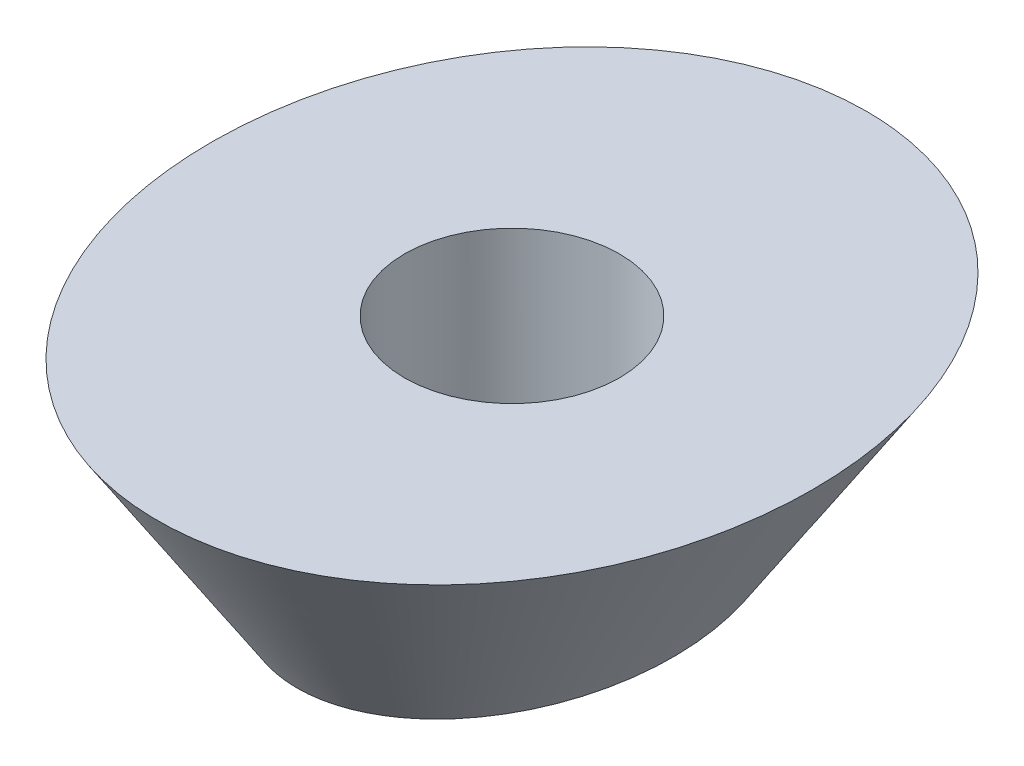
ISO-10303-21;
HEADER;
FILE_DESCRIPTION(('STEP AP214'),'2;1');
FILE_NAME('part.step','',(''),(''),'','','');
FILE_SCHEMA(('AUTOMOTIVE_DESIGN { 1 0 10303 214 1 1 1 1 }'));
ENDSEC;
DATA;
#1=APPLICATION_CONTEXT('core data for automotive mechanical design processes');
#2=APPLICATION_PROTOCOL_DEFINITION('international standard','automotive_design',2000,#1);
#3=PRODUCT_CONTEXT('',#1,'mechanical');
#4=PRODUCT('Part','Part','',(#3));
#5=PRODUCT_RELATED_PRODUCT_CATEGORY('part','',(#4));
#6=PRODUCT_DEFINITION_FORMATION('','',#4);
#7=PRODUCT_DEFINITION_CONTEXT('part definition',#1,'design');
#8=PRODUCT_DEFINITION('design','',#6,#7);
#9=PRODUCT_DEFINITION_SHAPE('','',#8);
#10=(LENGTH_UNIT() NAMED_UNIT(*) SI_UNIT(.MILLI.,.METRE.));
#11=(NAMED_UNIT(*) PLANE_ANGLE_UNIT() SI_UNIT($,.RADIAN.));
#12=(NAMED_UNIT(*) SI_UNIT($,.STERADIAN.) SOLID_ANGLE_UNIT());
#13=UNCERTAINTY_MEASURE_WITH_UNIT(LENGTH_MEASURE(1.E-05),#10,'distance_accuracy_value','');
#14=(GEOMETRIC_REPRESENTATION_CONTEXT(3) GLOBAL_UNCERTAINTY_ASSIGNED_CONTEXT((#13)) GLOBAL_UNIT_ASSIGNED_CONTEXT((#10,
#11,#12)) REPRESENTATION_CONTEXT('',''));
#15=CARTESIAN_POINT('',(0.,0.,0.));
#16=DIRECTION('',(0.,0.,1.));
#17=DIRECTION('',(1.,0.,0.));
#18=AXIS2_PLACEMENT_3D('',#15,#16,#17);
#19=CARTESIAN_POINT('',(0.,4.8,-7.11715644734806));
#20=CARTESIAN_POINT('',(-0.468372798234625,4.8,-7.11715644731902));
#21=CARTESIAN_POINT('',(-0.936415652271608,4.8,-7.05493538363841));
#22=CARTESIAN_POINT('',(-1.83231581849958,4.8,-6.81732789734766));
#23=CARTESIAN_POINT('',(-2.25987549087552,4.8,-6.64243262365492));
#24=CARTESIAN_POINT('',(-3.05022561451444,4.8,-6.20593431978818));
#25=CARTESIAN_POINT('',(-3.41320897304809,4.8,-5.94470711533813));
#26=CARTESIAN_POINT('',(-4.06730402702556,4.8,-5.36197067542401));
#27=CARTESIAN_POINT('',(-4.3586913790227,4.8,-5.0405264826891));
#28=CARTESIAN_POINT('',(-5.12775374626888,4.8,-4.01511001408688));
#29=CARTESIAN_POINT('',(-5.50117252272794,4.8,-3.25150960957499));
#30=CARTESIAN_POINT('',(-5.99574162187798,4.8,-1.65951572680395));
#31=CARTESIAN_POINT('',(-6.11715644734806,4.8,-0.829624889736534));
#32=CARTESIAN_POINT('',(-6.11715644734806,4.8,0.829624889736534));
#33=CARTESIAN_POINT('',(-5.99574162187776,4.8,1.65951572680418));
#34=CARTESIAN_POINT('',(-5.50117252272816,4.8,3.25150960957477));
#35=CARTESIAN_POINT('',(-5.12775374626867,4.8,4.01511001408682));
#36=CARTESIAN_POINT('',(-4.35869137902279,4.8,5.04052648268914));
#37=CARTESIAN_POINT('',(-4.06730402702548,4.8,5.36197067542402));
#38=CARTESIAN_POINT('',(-3.41320897304817,4.8,5.94470711533812));
#39=CARTESIAN_POINT('',(-3.0502256145144,4.8,6.20593431978825));
#40=CARTESIAN_POINT('',(-2.25987549087557,4.8,6.64243262365484));
#41=CARTESIAN_POINT('',(-1.83231581849958,4.79999999999991,6.81732789734738));
#42=CARTESIAN_POINT('',(-0.936415652271623,4.80000000000009,7.0549353836387));
#43=CARTESIAN_POINT('',(-0.46837273695167,4.8,7.11715644734806));
#44=CARTESIAN_POINT('',(0.468372736951669,4.8,7.11715644734806));
#45=CARTESIAN_POINT('',(0.936415652271613,4.8,7.05493538363853));
#46=CARTESIAN_POINT('',(1.83231581849957,4.8,6.81732789734755));
#47=CARTESIAN_POINT('',(2.25987549087547,4.8,6.64243262365493));
#48=CARTESIAN_POINT('',(3.05022561451447,4.8,6.20593431978817));
#49=CARTESIAN_POINT('',(3.41320897304811,4.8,5.94470711533812));
#50=CARTESIAN_POINT('',(4.06730402702552,4.8,5.36197067542403));
#51=CARTESIAN_POINT('',(4.3586913790229,4.8,5.04052648268923));
#52=CARTESIAN_POINT('',(5.12775374626848,4.8,4.01511001408661));
#53=CARTESIAN_POINT('',(5.50117252272772,4.8,3.25150960957492));
#54=CARTESIAN_POINT('',(5.99574162187819,4.8,1.65951572680405));
#55=CARTESIAN_POINT('',(6.11715644734806,4.8,0.829624889736524));
#56=CARTESIAN_POINT('',(6.11715644734806,4.8,-0.829624889736545));
#57=CARTESIAN_POINT('',(5.99574162187798,4.8,-1.65951572680414));
#58=CARTESIAN_POINT('',(5.50117252272795,4.8,-3.25150960957479));
#59=CARTESIAN_POINT('',(5.12775374626869,4.8,-4.01511001408653));
#60=CARTESIAN_POINT('',(4.35869137902281,4.8,-5.04052648268925));
#61=CARTESIAN_POINT('',(4.06730402702544,4.8,-5.36197067542393));
#62=CARTESIAN_POINT('',(3.41320897304822,4.8,-5.94470711533821));
#63=CARTESIAN_POINT('',(3.05022561451441,4.8,-6.20593431978821));
#64=CARTESIAN_POINT('',(2.25987549087556,4.8,-6.64243262365487));
#65=CARTESIAN_POINT('',(1.83231581849958,4.8,-6.81732789734756));
#66=CARTESIAN_POINT('',(0.936415652271627,4.8,-7.05493538363851));
#67=CARTESIAN_POINT('',(0.468372798234625,4.8,-7.1171564473771));
#68=CARTESIAN_POINT('',(0.,4.8,-7.11715644734806));
#69=CARTESIAN_POINT('',(0.,0.,-4.));
#70=CARTESIAN_POINT('',(-0.196349548121567,0.,-3.9999999999977));
#71=CARTESIAN_POINT('',(-0.392694230033098,0.,-3.97421564756369));
#72=CARTESIAN_POINT('',(-0.777847702063671,0.,-3.87206659566215));
#73=CARTESIAN_POINT('',(-0.966646978102348,0.,-3.79570441669364));
#74=CARTESIAN_POINT('',(-1.32945361608819,0.,-3.59533184339666));
#75=CARTESIAN_POINT('',(-1.50345202489101,0.,-3.47132639392211));
#76=CARTESIAN_POINT('',(-1.82996937322661,0.,-3.18043050449826));
#77=CARTESIAN_POINT('',(-1.98248025359338,0.,-3.01354724470113));
#78=CARTESIAN_POINT('',(-2.39900052349218,0.,-2.45818688483631));
#79=CARTESIAN_POINT('',(-2.62135916673537,0.,-2.01447591609965));
#80=CARTESIAN_POINT('',(-2.92191802833235,0.,-1.04699154282106));
#81=CARTESIAN_POINT('',(-3.,0.,-0.523598770144145));
#82=CARTESIAN_POINT('',(-3.,0.,0.523598770144145));
#83=CARTESIAN_POINT('',(-2.92191802833235,0.,1.04699154282112));
#84=CARTESIAN_POINT('',(-2.62135916673537,0.,2.0144759160996));
#85=CARTESIAN_POINT('',(-2.39900052349216,0.,2.4581868848362));
#86=CARTESIAN_POINT('',(-1.98248025359338,0.,3.01354724470119));
#87=CARTESIAN_POINT('',(-1.8299693732266,0.,3.18043050449826));
#88=CARTESIAN_POINT('',(-1.50345202489102,0.,3.4713263939221));
#89=CARTESIAN_POINT('',(-1.32945361608818,0.,3.59533184339669));
#90=CARTESIAN_POINT('',(-0.966646978102371,0.,3.7957044166936));
#91=CARTESIAN_POINT('',(-0.777847702063673,0.,3.87206659566209));
#92=CARTESIAN_POINT('',(-0.392694230033101,0.,3.97421564756375));
#93=CARTESIAN_POINT('',(-0.19634953721326,0.,4.));
#94=CARTESIAN_POINT('',(0.196349537213259,0.,4.));
#95=CARTESIAN_POINT('',(0.392694230033096,0.,3.97421564756366));
#96=CARTESIAN_POINT('',(0.777847702063668,0.,3.87206659566218));
#97=CARTESIAN_POINT('',(0.96664697810234,0.,3.7957044166936));
#98=CARTESIAN_POINT('',(1.32945361608819,0.,3.59533184339669));
#99=CARTESIAN_POINT('',(1.50345202489104,0.,3.4713263939221));
#100=CARTESIAN_POINT('',(1.82996937322657,0.,3.18043050449826));
#101=CARTESIAN_POINT('',(1.98248025359344,0.,3.01354724470118));
#102=CARTESIAN_POINT('',(2.39900052349206,0.,2.4581868848362));
#103=CARTESIAN_POINT('',(2.62135916673535,0.,2.01447591609975));
#104=CARTESIAN_POINT('',(2.92191802833237,0.,1.04699154282098));
#105=CARTESIAN_POINT('',(3.,0.,0.523598770144139));
#106=CARTESIAN_POINT('',(3.,0.,-0.523598770144152));
#107=CARTESIAN_POINT('',(2.92191802833237,0.,-1.04699154282108));
#108=CARTESIAN_POINT('',(2.62135916673536,0.,-2.01447591609963));
#109=CARTESIAN_POINT('',(2.3990005234922,0.,-2.45818688483621));
#110=CARTESIAN_POINT('',(1.98248025359337,0.,-3.01354724470117));
#111=CARTESIAN_POINT('',(1.82996937322657,0.,-3.18043050449826));
#112=CARTESIAN_POINT('',(1.50345202489105,0.,-3.4713263939221));
#113=CARTESIAN_POINT('',(1.32945361608818,0.,-3.59533184339668));
#114=CARTESIAN_POINT('',(0.966646978102363,0.,-3.79570441669361));
#115=CARTESIAN_POINT('',(0.777847702063665,0.,-3.87206659566211));
#116=CARTESIAN_POINT('',(0.392694230033112,0.,-3.97421564756373));
#117=CARTESIAN_POINT('',(0.196349548121567,0.,-4.0000000000023));
#118=CARTESIAN_POINT('',(0.,0.,-4.));
#119=B_SPLINE_SURFACE_WITH_KNOTS('',1,3,((#19,#20,#21,#22,#23,#24,#25,#26,#27,#28,#29,#30,#31,
#32,#33,#34,#35,#36,#37,#38,#39,#40,#41,#42,#43,#44,#45,#46,#47,#48,#49,#50,#51,#52,#53,#54,#55,
#56,#57,#58,#59,#60,#61,#62,#63,#64,#65,#66,#67,#68),(#69,#70,#71,#72,#73,#74,#75,#76,#77,#78,
#79,#80,#81,#82,#83,#84,#85,#86,#87,#88,#89,#90,#91,#92,#93,#94,#95,#96,#97,#98,#99,#100,#101,
#102,#103,#104,#105,#106,#107,#108,#109,#110,#111,#112,#113,#114,#115,#116,#117,#118)),
.UNSPECIFIED.,.F.,.T.,.F.,(2,2),(4,2,2,2,2,2,2,2,2,2,2,2,2,2,2,2,2,2,2,2,2,2,2,2,4),(0.,1.),(0.,
0.196349540849362,0.392699081698724,0.589048622548086,0.785398163397448,1.17809724509617,
1.5707963267949,1.96349540849362,2.35619449019234,2.55254403104171,2.74889357189107,
2.94524311274043,3.14159265358979,3.33794219443916,3.53429173528852,3.73064127613788,
3.92699081698724,4.31968989868597,4.71238898038469,5.10508806208341,5.49778714378214,
5.6941366846315,5.89048622548086,6.08683576633022,6.28318530717959),.UNSPECIFIED.);
#120=CARTESIAN_POINT('',(0.,4.,6.59763037279005));
#121=CARTESIAN_POINT('',(0.138631116862981,4.,6.59763053452745));
#122=CARTESIAN_POINT('',(0.27726054973254,4.,6.59160269040934));
#123=CARTESIAN_POINT('',(0.553498096117709,4.,6.56778523984111));
#124=CARTESIAN_POINT('',(0.691106210932047,4.,6.54999564835007));
#125=CARTESIAN_POINT('',(0.964337212031002,4.,6.50286110257067));
#126=CARTESIAN_POINT('',(1.09996002694897,4.,6.47351573393337));
#127=CARTESIAN_POINT('',(1.36821756636442,4.,6.40341857178731));
#128=CARTESIAN_POINT('',(1.50085230529413,4.,6.3626668333834));
#129=CARTESIAN_POINT('',(1.76200794267576,4.,6.27047626526121));
#130=CARTESIAN_POINT('',(1.89053767619937,4.,6.21906246403149));
#131=CARTESIAN_POINT('',(2.14299479957962,4.,6.10605801842716));
#132=CARTESIAN_POINT('',(2.26692222090733,4.,6.0444674436581));
#133=CARTESIAN_POINT('',(2.63077406220604,4.,5.84515279868461));
#134=CARTESIAN_POINT('',(2.86293724155269,4.,5.69282547132878));
#135=CARTESIAN_POINT('',(3.19874416787004,4.,5.43464953419965));
#136=CARTESIAN_POINT('',(3.31166027436498,4.,5.340439738385));
#137=CARTESIAN_POINT('',(3.52993096798742,4.,5.14357043976476));
#138=CARTESIAN_POINT('',(3.6352853850305,4.,5.0409107470078));
#139=CARTESIAN_POINT('',(3.83807757988468,4.,4.82802706053321));
#140=CARTESIAN_POINT('',(3.93551327541895,4.,4.71780109118153));
#141=CARTESIAN_POINT('',(4.12222444186623,4.,4.4906362118355));
#142=CARTESIAN_POINT('',(4.21149904138122,4.,4.37369658715829));
#143=CARTESIAN_POINT('',(4.39258737007877,4.,4.11872291231806));
#144=CARTESIAN_POINT('',(4.48328551624406,4.,3.97989519591661));
#145=CARTESIAN_POINT('',(4.65397917225272,4.,3.69584471924403));
#146=CARTESIAN_POINT('',(4.73397418044073,4.,3.5506216596473));
#147=CARTESIAN_POINT('',(4.957867252426,4.,3.10675874242896));
#148=CARTESIAN_POINT('',(5.08570530663447,4.,2.79987959602241));
#149=CARTESIAN_POINT('',(5.31569966537978,4.,2.12273310263659));
#150=CARTESIAN_POINT('',(5.41070132352746,4.,1.75006385737153));
#151=CARTESIAN_POINT('',(5.54453404105805,4.,0.994512394405259));
#152=CARTESIAN_POINT('',(5.58333111112678,4.,0.61162413923474));
#153=CARTESIAN_POINT('',(5.60057814606717,4.,0.011883551846272));
#154=CARTESIAN_POINT('',(5.59795872826184,4.,-0.204610037299844));
#155=CARTESIAN_POINT('',(5.57502772314921,4.,-0.636746048245827));
#156=CARTESIAN_POINT('',(5.55471309183651,4.,-0.852388317186284));
#157=CARTESIAN_POINT('',(5.49620939444608,4.,-1.28144074678698));
#158=CARTESIAN_POINT('',(5.45800342867334,4.,-1.49484860160921));
#159=CARTESIAN_POINT('',(5.36362877553437,4.,-1.9175701512093));
#160=CARTESIAN_POINT('',(5.3074679204221,4.,-2.1268855890059));
#161=CARTESIAN_POINT('',(5.17614849549433,4.,-2.5430011345345));
#162=CARTESIAN_POINT('',(5.10071378147414,4.,-2.74971446695683));
#163=CARTESIAN_POINT('',(4.93105706493666,4.,-3.15525033161455));
#164=CARTESIAN_POINT('',(4.83684005903408,4.,-3.35407494563846));
#165=CARTESIAN_POINT('',(4.62972071089114,4.,-3.7412126795497));
#166=CARTESIAN_POINT('',(4.51686101798824,4.,-3.92954850934014));
#167=CARTESIAN_POINT('',(4.27250270186423,4.,-4.29399829151783));
#168=CARTESIAN_POINT('',(4.14098441695062,4.,-4.47009905567432));
#169=CARTESIAN_POINT('',(3.7989125490882,4.,-4.88009664853678));
#170=CARTESIAN_POINT('',(3.57875140447251,4.,-5.10612070918666));
#171=CARTESIAN_POINT('',(3.10405260157501,4.,-5.51845488750144));
#172=CARTESIAN_POINT('',(2.84956167537123,4.,-5.70481812044529));
#173=CARTESIAN_POINT('',(2.44552737560882,4.,-5.94886800074731));
#174=CARTESIAN_POINT('',(2.30659851619608,4.,-6.02450715402067));
#175=CARTESIAN_POINT('',(2.02242419785648,4.,-6.16268475754527));
#176=CARTESIAN_POINT('',(1.87718257223077,4.,-6.22523102759742));
#177=CARTESIAN_POINT('',(1.5815028535599,4.,-6.33651037811633));
#178=CARTESIAN_POINT('',(1.4310648889058,4.,-6.38524379959725));
#179=CARTESIAN_POINT('',(1.12616348660327,4.,-6.4679690860128));
#180=CARTESIAN_POINT('',(0.971699849187651,4.,-6.5019602179041));
#181=CARTESIAN_POINT('',(0.675525722629013,4.,-6.55232232190789));
#182=CARTESIAN_POINT('',(0.53405121203949,4.,-6.5700950664136));
#183=CARTESIAN_POINT('',(0.250094058303988,4.,-6.59319955611487));
#184=CARTESIAN_POINT('',(0.107611540114033,4.,-6.59853281715578));
#185=CARTESIAN_POINT('',(-0.177218932837008,4.,-6.59647474715602));
#186=CARTESIAN_POINT('',(-0.319566914071933,4.,-6.58908697086303));
#187=CARTESIAN_POINT('',(-0.60307509862769,4.,-6.56194092007068));
#188=CARTESIAN_POINT('',(-0.744235279609914,4.,-6.54218241344327));
#189=CARTESIAN_POINT('',(-1.01880377910114,4.,-6.4914996016979));
#190=CARTESIAN_POINT('',(-1.15229878563763,4.,-6.46104439963539));
#191=CARTESIAN_POINT('',(-1.41626244411293,4.,-6.38908531018375));
#192=CARTESIAN_POINT('',(-1.54673126059613,4.,-6.34758202505516));
#193=CARTESIAN_POINT('',(-1.80387143222438,4.,-6.25413453464319));
#194=CARTESIAN_POINT('',(-1.93054290526527,4.,-6.20219065389479));
#195=CARTESIAN_POINT('',(-2.17931370247719,4.,-6.08839107594878));
#196=CARTESIAN_POINT('',(-2.30141274935868,4.,-6.02653477882106));
#197=CARTESIAN_POINT('',(-2.66745479111658,4.,-5.82260778602193));
#198=CARTESIAN_POINT('',(-2.90307486802154,4.,-5.66511830962363));
#199=CARTESIAN_POINT('',(-3.23619628438877,4.,-5.40377169600473));
#200=CARTESIAN_POINT('',(-3.34388911308156,4.,-5.31243118394983));
#201=CARTESIAN_POINT('',(-3.55231723216265,4.,-5.12199772421688));
#202=CARTESIAN_POINT('',(-3.65304874355125,4.,-5.02290062710979));
#203=CARTESIAN_POINT('',(-3.96382001051014,4.,-4.69447486878323));
#204=CARTESIAN_POINT('',(-4.15984368271688,4.,-4.45167589318014));
#205=CARTESIAN_POINT('',(-4.51469153718477,4.,-3.94020921494057));
#206=CARTESIAN_POINT('',(-4.67348113577135,4.,-3.6715177871294));
#207=CARTESIAN_POINT('',(-4.89357256725144,4.,-3.23363807568632));
#208=CARTESIAN_POINT('',(-4.96762084618374,4.,-3.0707087559788));
#209=CARTESIAN_POINT('',(-5.10322870991775,4.,-2.7398950899692));
#210=CARTESIAN_POINT('',(-5.16479997045553,4.,-2.5720155461202));
#211=CARTESIAN_POINT('',(-5.27571272646544,4.,-2.23212762226328));
#212=CARTESIAN_POINT('',(-5.32504409296685,4.,-2.06011595100707));
#213=CARTESIAN_POINT('',(-5.41145215430336,4.,-1.71299684354818));
#214=CARTESIAN_POINT('',(-5.44852526684158,4.,-1.53788851811523));
#215=CARTESIAN_POINT('',(-5.51514220295611,4.,-1.15878904639201));
#216=CARTESIAN_POINT('',(-5.54269134074561,4.,-0.954445263990977));
#217=CARTESIAN_POINT('',(-5.58167683319081,4.,-0.54416217045995));
#218=CARTESIAN_POINT('',(-5.59310709038315,4.,-0.338222285158978));
#219=CARTESIAN_POINT('',(-5.599961877739,4.,0.0740616727911534));
#220=CARTESIAN_POINT('',(-5.59537579263238,4.,0.280405922879037));
#221=CARTESIAN_POINT('',(-5.57010816523001,4.,0.692117138543059));
#222=CARTESIAN_POINT('',(-5.54942585139752,4.,0.89748405679822));
#223=CARTESIAN_POINT('',(-5.4896280312243,4.,1.32167151076266));
#224=CARTESIAN_POINT('',(-5.44921650121998,4.,1.54031119634191));
#225=CARTESIAN_POINT('',(-5.34949643880717,4.,1.97316037886592));
#226=CARTESIAN_POINT('',(-5.2901950694022,4.,2.18737152237295));
#227=CARTESIAN_POINT('',(-5.15269113368575,4.,2.60949112443432));
#228=CARTESIAN_POINT('',(-5.07450194619814,4.,2.81740392750056));
#229=CARTESIAN_POINT('',(-4.89894341477619,4.,3.22494778128936));
#230=CARTESIAN_POINT('',(-4.8015803617394,4.,3.42458152241369));
#231=CARTESIAN_POINT('',(-4.61183703493273,4.,3.76927033186811));
#232=CARTESIAN_POINT('',(-4.52331101812656,4.,3.91645687671001));
#233=CARTESIAN_POINT('',(-4.33488995640176,4.,4.20336783895771));
#234=CARTESIAN_POINT('',(-4.23499622153037,4.,4.34309311349964));
#235=CARTESIAN_POINT('',(-4.02404521037469,4.,4.61380214594887));
#236=CARTESIAN_POINT('',(-3.91299107438042,4.,4.74478834567413));
#237=CARTESIAN_POINT('',(-3.67998886213841,4.,4.99671318987794));
#238=CARTESIAN_POINT('',(-3.55804069787971,4.,5.11765175316817));
#239=CARTESIAN_POINT('',(-3.30279901374303,4.,5.34895719823384));
#240=CARTESIAN_POINT('',(-3.16942713044343,4.,5.45923781665248));
#241=CARTESIAN_POINT('',(-2.89292471723964,4.,5.66679107658796));
#242=CARTESIAN_POINT('',(-2.74979555994849,4.,5.76406554207868));
#243=CARTESIAN_POINT('',(-2.45480937712483,4.,5.94413588250223));
#244=CARTESIAN_POINT('',(-2.30295803629346,4.,6.02694104870149));
#245=CARTESIAN_POINT('',(-1.99171816109344,4.,6.1768711087278));
#246=CARTESIAN_POINT('',(-1.83233132732409,4.,6.24399952034269));
#247=CARTESIAN_POINT('',(-1.53635622919461,4.,6.35117517864127));
#248=CARTESIAN_POINT('',(-1.40073714045185,4.,6.39391381099451));
#249=CARTESIAN_POINT('',(-1.1263004471924,4.,6.46744177843769));
#250=CARTESIAN_POINT('',(-0.987483223567292,4.,6.49823252878272));
#251=CARTESIAN_POINT('',(-0.70776912971208,4.,6.54767294334011));
#252=CARTESIAN_POINT('',(-0.566873160453719,4.,6.56632771810559));
#253=CARTESIAN_POINT('',(-0.283984197472286,4.,6.59130628445153));
#254=CARTESIAN_POINT('',(-0.141991215428671,4.,6.59763020713251));
#255=CARTESIAN_POINT('',(0.,4.,6.59763037279005));
#256=B_SPLINE_CURVE_WITH_KNOTS('',3,(#120,#121,#122,#123,#124,#125,#126,#127,#128,#129,#130,
#131,#132,#133,#134,#135,#136,#137,#138,#139,#140,#141,#142,#143,#144,#145,#146,#147,#148,#149,
#150,#151,#152,#153,#154,#155,#156,#157,#158,#159,#160,#161,#162,#163,#164,#165,#166,#167,#168,
#169,#170,#171,#172,#173,#174,#175,#176,#177,#178,#179,#180,#181,#182,#183,#184,#185,#186,#187,
#188,#189,#190,#191,#192,#193,#194,#195,#196,#197,#198,#199,#200,#201,#202,#203,#204,#205,#206,
#207,#208,#209,#210,#211,#212,#213,#214,#215,#216,#217,#218,#219,#220,#221,#222,#223,#224,#225,
#226,#227,#228,#229,#230,#231,#232,#233,#234,#235,#236,#237,#238,#239,#240,#241,#242,#243,#244,
#245,#246,#247,#248,#249,#250,#251,#252,#253,#254,#255),.UNSPECIFIED.,.T.,.F.,(4,2,2,2,2,2,2,2,
2,2,2,2,2,2,2,2,2,2,2,2,2,2,2,2,2,2,2,2,2,2,2,2,2,2,2,2,2,2,2,2,2,2,2,2,2,2,2,2,2,2,2,2,2,2,2,2,
2,2,2,2,2,2,2,2,2,2,2,4),(0.,0.415766484787942,0.831532440787815,1.24731330602919,
1.66309216264325,2.0779058352727,2.49271667084072,3.32180546973864,3.76264345104883,
4.20349134498332,4.64445479002917,5.0854652639237,5.58244336972428,6.07944476070139,
7.07328227458411,8.22272208019116,9.37285671137156,10.021773418562,10.6708017771973,
11.3204444317726,11.9698040860177,12.62904731569,13.2881154017085,13.9456960887511,
14.6039749276506,15.5464629784083,16.487680757896,16.9616741010301,17.4353835360255,
17.9090812749759,18.3828025653001,18.8100365637464,19.2372184977713,19.6642810800855,
20.0913516761682,20.5016461088977,20.9119181799596,21.3221775001155,21.7324616598201,
22.5785049339055,23.0018491388339,23.4254213826243,24.3577040568291,25.2908492519399,
25.8272961884105,26.3632387868906,26.89962342969,27.4361646848644,28.0540801937157,
28.6722293855079,29.2907883503596,29.9093769662786,30.575568237034,31.2415071890159,
31.9069758119783,32.572226459016,33.0870035265007,33.6017213296175,34.1162947058994,
34.6308722397058,35.1493162894518,35.6676875565329,36.1857247253615,36.7036455372211,
37.1297237756852,37.5557515287489,37.9815997619045,38.407443467455),.UNSPECIFIED.);
#257=CARTESIAN_POINT('',(0.,4.,-6.59763037279005));
#258=VERTEX_POINT('',#257);
#259=EDGE_CURVE('E10',#258,#258,#256,.T.);
#260=CARTESIAN_POINT('',(0.,0.,4.));
#261=CARTESIAN_POINT('',(0.0680094170236579,0.,3.99999957301181));
#262=CARTESIAN_POINT('',(0.136041184134993,0.,3.99690128679831));
#263=CARTESIAN_POINT('',(0.271555992919706,0.,3.98459245021726));
#264=CARTESIAN_POINT('',(0.339038850077471,0.,3.97537992405997));
#265=CARTESIAN_POINT('',(0.473095576612726,0.,3.95097386453745));
#266=CARTESIAN_POINT('',(0.539666699221458,0.,3.93576518668002));
#267=CARTESIAN_POINT('',(0.671205794094407,0.,3.89962832985655));
#268=CARTESIAN_POINT('',(0.736174006196998,0.,3.87870101228062));
#269=CARTESIAN_POINT('',(0.92729406189635,0.,3.80815368874685));
#270=CARTESIAN_POINT('',(1.05058975403605,0.,3.75059216368131));
#271=CARTESIAN_POINT('',(1.28680257299082,0.,3.61739760120846));
#272=CARTESIAN_POINT('',(1.39972053240642,0.,3.54176601530907));
#273=CARTESIAN_POINT('',(1.5799733830115,0.,3.40216794915025));
#274=CARTESIAN_POINT('',(1.65039990762102,0.,3.34211936518376));
#275=CARTESIAN_POINT('',(1.78573233315834,0.,3.21605864229053));
#276=CARTESIAN_POINT('',(1.85063661626066,0.,3.15004476734052));
#277=CARTESIAN_POINT('',(1.97495474321491,0.,3.01286555111462));
#278=CARTESIAN_POINT('',(2.03435966572491,0.,2.94169216208135));
#279=CARTESIAN_POINT('',(2.14754501244409,0.,2.79499727376786));
#280=CARTESIAN_POINT('',(2.20132415559899,0.,2.71947479019322));
#281=CARTESIAN_POINT('',(2.31942031421367,0.,2.54035821670171));
#282=CARTESIAN_POINT('',(2.38170948770548,0.,2.43542451896294));
#283=CARTESIAN_POINT('',(2.49699654023725,0.,2.22056653216384));
#284=CARTESIAN_POINT('',(2.54999134549517,0.,2.11064060717604));
#285=CARTESIAN_POINT('',(2.64692334117258,0.,1.88682031351875));
#286=CARTESIAN_POINT('',(2.69085666004226,0.,1.77292427279875));
#287=CARTESIAN_POINT('',(2.76973513394139,0.,1.54208745434655));
#288=CARTESIAN_POINT('',(2.80468125660355,0.,1.42514700589365));
#289=CARTESIAN_POINT('',(2.86636223681063,0.,1.18698943888601));
#290=CARTESIAN_POINT('',(2.89294603628118,0.,1.06573337148828));
#291=CARTESIAN_POINT('',(2.93734110825672,0.,0.821628665481749));
#292=CARTESIAN_POINT('',(2.9551519751646,0.,0.698779953509994));
#293=CARTESIAN_POINT('',(2.9821138864705,0.,0.452089569784048));
#294=CARTESIAN_POINT('',(2.99126167234679,0.,0.328247542054136));
#295=CARTESIAN_POINT('',(3.00083658781149,0.,0.0802262148331478));
#296=CARTESIAN_POINT('',(3.00126342813925,0.,-0.0439530957084623));
#297=CARTESIAN_POINT('',(2.99266720719197,0.,-0.314770241102452));
#298=CARTESIAN_POINT('',(2.98189900104941,0.,-0.461355707744192));
#299=CARTESIAN_POINT('',(2.94821685929945,0.,-0.75316033723731));
#300=CARTESIAN_POINT('',(2.92529987771177,0.,-0.898379148139053));
#301=CARTESIAN_POINT('',(2.86710794534514,0.,-1.18629620721477));
#302=CARTESIAN_POINT('',(2.83183630065655,0.,-1.32899511898999));
#303=CARTESIAN_POINT('',(2.74842678490128,0.,-1.61055910179214));
#304=CARTESIAN_POINT('',(2.70029417169076,0.,-1.7494257140111));
#305=CARTESIAN_POINT('',(2.60551781775856,0.,-1.9855699533636));
#306=CARTESIAN_POINT('',(2.56189564797404,0.,-2.08406860159755));
#307=CARTESIAN_POINT('',(2.46747705920665,0.,-2.27758209144537));
#308=CARTESIAN_POINT('',(2.41668084821513,0.,-2.37259703395903));
#309=CARTESIAN_POINT('',(2.3078044548032,0.,-2.55821364113301));
#310=CARTESIAN_POINT('',(2.24973356078675,0.,-2.64882073254447));
#311=CARTESIAN_POINT('',(2.12603316787595,0.,-2.82471523890141));
#312=CARTESIAN_POINT('',(2.06040570878012,0.,-2.91000407990275));
#313=CARTESIAN_POINT('',(1.93743076251386,0.,-3.05546207564475));
#314=CARTESIAN_POINT('',(1.88161112457565,0.,-3.11692225043765));
#315=CARTESIAN_POINT('',(1.76551525859578,0.,-3.23543556898885));
#316=CARTESIAN_POINT('',(1.70523927345701,0.,-3.29248895260278));
#317=CARTESIAN_POINT('',(1.51781981343161,0.,-3.45599186082022));
#318=CARTESIAN_POINT('',(1.38388465513249,0.,-3.55502565469124));
#319=CARTESIAN_POINT('',(1.18336234625681,0.,-3.67667528194998));
#320=CARTESIAN_POINT('',(1.12314964724621,0.,-3.71013154359247));
#321=CARTESIAN_POINT('',(1.00025395803292,0.,-3.772123450708));
#322=CARTESIAN_POINT('',(0.937572345114689,0.,-3.80066179318874));
#323=CARTESIAN_POINT('',(0.810064984566843,0.,-3.85242592751253));
#324=CARTESIAN_POINT('',(0.745239632903679,0.,-3.87565269424367));
#325=CARTESIAN_POINT('',(0.6138139589016,0.,-3.91641049670524));
#326=CARTESIAN_POINT('',(0.547213625272104,0.,-3.93394149619578));
#327=CARTESIAN_POINT('',(0.412385938542105,0.,-3.96307006322192));
#328=CARTESIAN_POINT('',(0.344152262734647,0.,-3.97463845200886));
#329=CARTESIAN_POINT('',(0.206916446994399,0.,-3.99151740230216));
#330=CARTESIAN_POINT('',(0.137914355350982,0.,-3.99682835482782));
#331=CARTESIAN_POINT('',(-0.000292307968314414,0.,-4.00106168033605));
#332=CARTESIAN_POINT('',(-0.0694968964210395,0.,-3.99998350808741));
#333=CARTESIAN_POINT('',(-0.207484550629784,0.,-3.99147161985483));
#334=CARTESIAN_POINT('',(-0.276267779124175,0.,-3.98404053681048));
#335=CARTESIAN_POINT('',(-0.40750873704932,0.,-3.96381337067098));
#336=CARTESIAN_POINT('',(-0.470039129729081,0.,-3.95148427457755));
#337=CARTESIAN_POINT('',(-0.593866084807196,0.,-3.92174175787772));
#338=CARTESIAN_POINT('',(-0.655162834800428,0.,-3.90432911664542));
#339=CARTESIAN_POINT('',(-0.776168825701999,0.,-3.86468658357502));
#340=CARTESIAN_POINT('',(-0.835878224299046,0.,-3.84245717226133));
#341=CARTESIAN_POINT('',(-0.953432095842147,0.,-3.79349219531295));
#342=CARTESIAN_POINT('',(-1.01127578205265,0.,-3.76675475757411));
#343=CARTESIAN_POINT('',(-1.1881002678981,0.,-3.67693056478363));
#344=CARTESIAN_POINT('',(-1.30343331262597,0.,-3.60652168589638));
#345=CARTESIAN_POINT('',(-1.52307133047269,0.,-3.45014962438135));
#346=CARTESIAN_POINT('',(-1.62736095809176,0.,-3.36416523664994));
#347=CARTESIAN_POINT('',(-1.79868704414445,0.,-3.20351508445925));
#348=CARTESIAN_POINT('',(-1.86839201794584,0.,-3.13165431093251));
#349=CARTESIAN_POINT('',(-2.00121542215849,0.,-2.98220906435255));
#350=CARTESIAN_POINT('',(-2.06433972924406,0.,-2.90462980558878));
#351=CARTESIAN_POINT('',(-2.18416241126427,0.,-2.74439819522358));
#352=CARTESIAN_POINT('',(-2.2408456445001,0.,-2.66173456615389));
#353=CARTESIAN_POINT('',(-2.3477813157004,0.,-2.49232797942949));
#354=CARTESIAN_POINT('',(-2.39803132472249,0.,-2.40558349780344));
#355=CARTESIAN_POINT('',(-2.50642343328148,0.,-2.20216048931411));
#356=CARTESIAN_POINT('',(-2.56239789504779,0.,-2.08432144510946));
#357=CARTESIAN_POINT('',(-2.66398569583845,0.,-1.84430780804941));
#358=CARTESIAN_POINT('',(-2.70959758388993,0.,-1.72213261080936));
#359=CARTESIAN_POINT('',(-2.8311142535112,0.,-1.35056166827563));
#360=CARTESIAN_POINT('',(-2.89176965506955,0.,-1.09598679452216));
#361=CARTESIAN_POINT('',(-2.95416143529953,0.,-0.707834653865679));
#362=CARTESIAN_POINT('',(-2.97020387692955,0.,-0.576280685603174));
#363=CARTESIAN_POINT('',(-2.9924211568321,0.,-0.312337869056212));
#364=CARTESIAN_POINT('',(-2.99859655352586,0.,-0.179949068444501));
#365=CARTESIAN_POINT('',(-3.0021666857278,0.,0.217614789572942));
#366=CARTESIAN_POINT('',(-2.9845957619974,0.,0.483127311764248));
#367=CARTESIAN_POINT('',(-2.92619372906341,0.,0.893411038822207));
#368=CARTESIAN_POINT('',(-2.89886983265401,0.,1.04027895872393));
#369=CARTESIAN_POINT('',(-2.83127224663845,0.,1.33110555366999));
#370=CARTESIAN_POINT('',(-2.79099621416443,0.,1.4750636973637));
#371=CARTESIAN_POINT('',(-2.69707929118918,0.,1.75831946148179));
#372=CARTESIAN_POINT('',(-2.64345838363212,0.,1.89762370017317));
#373=CARTESIAN_POINT('',(-2.52263300396412,0.,2.17018834762399));
#374=CARTESIAN_POINT('',(-2.45543617573201,0.,2.30345210598817));
#375=CARTESIAN_POINT('',(-2.33421560595206,0.,2.51456908291794));
#376=CARTESIAN_POINT('',(-2.28437870971256,0.,2.59484314816144));
#377=CARTESIAN_POINT('',(-2.17890737421536,0.,2.75149089223746));
#378=CARTESIAN_POINT('',(-2.12327387632814,0.,2.82786520139938));
#379=CARTESIAN_POINT('',(-2.00623007816877,0.,2.97590936980617));
#380=CARTESIAN_POINT('',(-1.94482760182968,0.,3.0475853830594));
#381=CARTESIAN_POINT('',(-1.81625383456623,0.,3.18551526931859));
#382=CARTESIAN_POINT('',(-1.74908348182579,0.,3.25177002071839));
#383=CARTESIAN_POINT('',(-1.56614867222681,0.,3.41647906224613));
#384=CARTESIAN_POINT('',(-1.44572562958339,0.,3.50993665590905));
#385=CARTESIAN_POINT('',(-1.25498862900101,0.,3.63440161465774));
#386=CARTESIAN_POINT('',(-1.18970711907695,0.,3.67327797014655));
#387=CARTESIAN_POINT('',(-1.05601934988353,0.,3.74522190770274));
#388=CARTESIAN_POINT('',(-0.987613585009695,0.,3.77829040484512));
#389=CARTESIAN_POINT('',(-0.797157790548053,0.,3.85987579401177));
#390=CARTESIAN_POINT('',(-0.672331577833872,0.,3.90209706603036));
#391=CARTESIAN_POINT('',(-0.417561100606865,0.,3.96480862901048));
#392=CARTESIAN_POINT('',(-0.28763205113893,0.,3.98535908772654));
#393=CARTESIAN_POINT('',(-0.130963755000461,0.,3.99633293459903));
#394=CARTESIAN_POINT('',(-0.10479368422836,0.,3.99770656689045));
#395=CARTESIAN_POINT('',(-0.0524168507576157,0.,3.99954022042089));
#396=CARTESIAN_POINT('',(-0.0262100851491309,0.,4.00000016455658));
#397=CARTESIAN_POINT('',(0.,0.,4.));
#398=B_SPLINE_CURVE_WITH_KNOTS('',3,(#260,#261,#262,#263,#264,#265,#266,#267,#268,#269,#270,
#271,#272,#273,#274,#275,#276,#277,#278,#279,#280,#281,#282,#283,#284,#285,#286,#287,#288,#289,
#290,#291,#292,#293,#294,#295,#296,#297,#298,#299,#300,#301,#302,#303,#304,#305,#306,#307,#308,
#309,#310,#311,#312,#313,#314,#315,#316,#317,#318,#319,#320,#321,#322,#323,#324,#325,#326,#327,
#328,#329,#330,#331,#332,#333,#334,#335,#336,#337,#338,#339,#340,#341,#342,#343,#344,#345,#346,
#347,#348,#349,#350,#351,#352,#353,#354,#355,#356,#357,#358,#359,#360,#361,#362,#363,#364,#365,
#366,#367,#368,#369,#370,#371,#372,#373,#374,#375,#376,#377,#378,#379,#380,#381,#382,#383,#384,
#385,#386,#387,#388,#389,#390,#391,#392,#393,#394,#395,#396,#397),.UNSPECIFIED.,.T.,.F.,(4,2,2,
2,2,2,2,2,2,2,2,2,2,2,2,2,2,2,2,2,2,2,2,2,2,2,2,2,2,2,2,2,2,2,2,2,2,2,2,2,2,2,2,2,2,2,2,2,2,2,2,
2,2,2,2,2,2,2,2,2,2,2,2,2,2,2,2,2,4),(0.,0.203997556639196,0.408061066308612,0.612643315772748,
0.81719476629099,1.22349925305531,1.62977111369678,1.90708036950115,2.18447058956173,
2.46230319703176,2.74019893307384,3.10576306869974,3.47144787463123,3.83728859841974,
4.20308991639337,4.57516303345875,4.94725335088656,5.31948357043214,5.69172613627447,
6.13214793079273,6.57268020154975,7.01309467644302,7.453329374648,7.77624391287148,
8.0991490910091,8.42164610362131,8.74405626546069,8.99289580332696,9.24172178763985,
9.73844201609042,9.94493106503683,10.1513065116331,10.3576440495668,10.5639829003179,
10.7713221304195,10.9786484034665,11.1859923694506,11.3932504441568,11.5842374175805,
11.7751951255607,11.9661337922271,12.1571519485577,12.5608817218464,12.9651653370962,
13.2651226082197,13.564809674237,13.8651872755189,14.165677955649,14.5564879378852,
14.9473526078563,15.7286349959812,16.1259449141477,16.5232323459308,17.3179876983966,
17.7657023414765,18.2134980157324,18.6606271422712,19.1075052123066,19.3907418520021,
19.6739325654357,19.9567446098946,20.2395107398934,20.6946770836781,20.9223818177161,
21.1500506427864,21.5435756446022,21.9360051470323,22.0146169396556,22.0932353658048),.UNSPECIFIED.);
#399=CARTESIAN_POINT('',(0.,0.,-4.));
#400=VERTEX_POINT('',#399);
#401=EDGE_CURVE('E51',#400,#400,#398,.T.);
#402=CARTESIAN_POINT('',(0.,4.,-6.59763037279005));
#403=CARTESIAN_POINT('',(0.,3.95833333333333,-6.57057172307349));
#404=CARTESIAN_POINT('',(0.,3.91666666666667,-6.54351307335692));
#405=CARTESIAN_POINT('',(0.,3.83333333333333,-6.4893957739238));
#406=CARTESIAN_POINT('',(0.,3.79166666666667,-6.46233712420723));
#407=CARTESIAN_POINT('',(0.,3.70833333333333,-6.40821982477411));
#408=CARTESIAN_POINT('',(0.,3.66666666666667,-6.38116117505754));
#409=CARTESIAN_POINT('',(0.,3.58333333333333,-6.32704387562442));
#410=CARTESIAN_POINT('',(0.,3.54166666666667,-6.29998522590786));
#411=CARTESIAN_POINT('',(0.,3.45833333333333,-6.24586792647473));
#412=CARTESIAN_POINT('',(0.,3.41666666666667,-6.21880927675817));
#413=CARTESIAN_POINT('',(0.,3.33333333333333,-6.16469197732504));
#414=CARTESIAN_POINT('',(0.,3.29166666666667,-6.13763332760848));
#415=CARTESIAN_POINT('',(0.,3.20833333333333,-6.08351602817535));
#416=CARTESIAN_POINT('',(0.,3.16666666666667,-6.05645737845879));
#417=CARTESIAN_POINT('',(0.,3.08333333333333,-6.00234007902566));
#418=CARTESIAN_POINT('',(0.,3.04166666666667,-5.9752814293091));
#419=CARTESIAN_POINT('',(0.,2.95833333333333,-5.92116412987597));
#420=CARTESIAN_POINT('',(0.,2.91666666666667,-5.89410548015941));
#421=CARTESIAN_POINT('',(0.,2.83333333333333,-5.83998818072628));
#422=CARTESIAN_POINT('',(0.,2.79166666666667,-5.81292953100972));
#423=CARTESIAN_POINT('',(0.,2.70833333333333,-5.7588122315766));
#424=CARTESIAN_POINT('',(0.,2.66666666666667,-5.73175358186003));
#425=CARTESIAN_POINT('',(0.,2.58333333333333,-5.67763628242691));
#426=CARTESIAN_POINT('',(0.,2.54166666666667,-5.65057763271034));
#427=CARTESIAN_POINT('',(0.,2.45833333333333,-5.59646033327722));
#428=CARTESIAN_POINT('',(0.,2.41666666666667,-5.56940168356066));
#429=CARTESIAN_POINT('',(0.,2.33333333333333,-5.51528438412753));
#430=CARTESIAN_POINT('',(0.,2.29166666666667,-5.48822573441097));
#431=CARTESIAN_POINT('',(0.,2.20833333333333,-5.43410843497784));
#432=CARTESIAN_POINT('',(0.,2.16666666666667,-5.40704978526128));
#433=CARTESIAN_POINT('',(0.,2.08333333333333,-5.35293248582815));
#434=CARTESIAN_POINT('',(0.,2.04166666666667,-5.32587383611159));
#435=CARTESIAN_POINT('',(0.,1.95833333333333,-5.27175653667846));
#436=CARTESIAN_POINT('',(0.,1.91666666666667,-5.2446978869619));
#437=CARTESIAN_POINT('',(0.,1.83333333333333,-5.19058058752877));
#438=CARTESIAN_POINT('',(0.,1.79166666666667,-5.16352193781221));
#439=CARTESIAN_POINT('',(0.,1.70833333333333,-5.10940463837908));
#440=CARTESIAN_POINT('',(0.,1.66666666666667,-5.08234598866252));
#441=CARTESIAN_POINT('',(0.,1.58333333333333,-5.02822868922939));
#442=CARTESIAN_POINT('',(0.,1.54166666666667,-5.00117003951283));
#443=CARTESIAN_POINT('',(0.,1.45833333333333,-4.94705274007971));
#444=CARTESIAN_POINT('',(0.,1.41666666666667,-4.91999409036314));
#445=CARTESIAN_POINT('',(0.,1.33333333333333,-4.86587679093002));
#446=CARTESIAN_POINT('',(0.,1.29166666666667,-4.83881814121345));
#447=CARTESIAN_POINT('',(0.,1.20833333333333,-4.78470084178033));
#448=CARTESIAN_POINT('',(0.,1.16666666666667,-4.75764219206376));
#449=CARTESIAN_POINT('',(0.,1.08333333333333,-4.70352489263064));
#450=CARTESIAN_POINT('',(0.,1.04166666666667,-4.67646624291408));
#451=CARTESIAN_POINT('',(0.,0.958333333333333,-4.62234894348095));
#452=CARTESIAN_POINT('',(0.,0.916666666666667,-4.59529029376439));
#453=CARTESIAN_POINT('',(0.,0.833333333333333,-4.54117299433126));
#454=CARTESIAN_POINT('',(0.,0.791666666666667,-4.5141143446147));
#455=CARTESIAN_POINT('',(0.,0.708333333333333,-4.45999704518157));
#456=CARTESIAN_POINT('',(0.,0.666666666666667,-4.43293839546501));
#457=CARTESIAN_POINT('',(0.,0.583333333333334,-4.37882109603188));
#458=CARTESIAN_POINT('',(0.,0.541666666666667,-4.35176244631532));
#459=CARTESIAN_POINT('',(0.,0.458333333333333,-4.29764514688219));
#460=CARTESIAN_POINT('',(0.,0.416666666666667,-4.27058649716563));
#461=CARTESIAN_POINT('',(0.,0.333333333333334,-4.2164691977325));
#462=CARTESIAN_POINT('',(0.,0.291666666666667,-4.18941054801594));
#463=CARTESIAN_POINT('',(0.,0.208333333333334,-4.13529324858282));
#464=CARTESIAN_POINT('',(0.,0.166666666666667,-4.10823459886625));
#465=CARTESIAN_POINT('',(0.,0.0833333333333335,-4.05411729943313));
#466=CARTESIAN_POINT('',(0.,0.0416666666666667,-4.02705864971656));
#467=CARTESIAN_POINT('',(0.,0.,-4.));
#468=B_SPLINE_CURVE_WITH_KNOTS('',3,(#402,#403,#404,#405,#406,#407,#408,#409,#410,#411,#412,
#413,#414,#415,#416,#417,#418,#419,#420,#421,#422,#423,#424,#425,#426,#427,#428,#429,#430,#431,
#432,#433,#434,#435,#436,#437,#438,#439,#440,#441,#442,#443,#444,#445,#446,#447,#448,#449,#450,
#451,#452,#453,#454,#455,#456,#457,#458,#459,#460,#461,#462,#463,#464,#465,#466,#467),
.UNSPECIFIED.,.F.,.F.,(4,2,2,2,2,2,2,2,2,2,2,2,2,2,2,2,2,2,2,2,2,2,2,2,2,2,2,2,2,2,2,2,4),(0.,
0.149045411604493,0.298090823208987,0.447136234813481,0.596181646417974,0.745227058022467,
0.894272469626961,1.04331788123145,1.19236329283595,1.34140870444044,1.49045411604493,
1.63949952764943,1.78854493925392,1.93759035085842,2.08663576246291,2.2356811740674,
2.3847265856719,2.53377199727639,2.68281740888088,2.83186282048538,2.98090823208987,
3.12995364369436,3.27899905529886,3.42804446690335,3.57708987850784,3.72613529011234,
3.87518070171683,4.02422611332132,4.17327152492582,4.32231693653031,4.47136234813481,
4.6204077597393,4.76945317134379),.UNSPECIFIED.);
#469=EDGE_CURVE('BSEAM45',#258,#400,#468,.T.);
#470=ORIENTED_EDGE('',*,*,#259,.F.);
#471=ORIENTED_EDGE('',*,*,#401,.T.);
#472=ORIENTED_EDGE('',*,*,#469,.T.);
#473=ORIENTED_EDGE('',*,*,#469,.F.);
#474=EDGE_LOOP('',(#470,#472,#471,#473));
#475=FACE_BOUND('',#474,.T.);
#476=ADVANCED_FACE('F45',(#475),#119,.T.);
#477=CARTESIAN_POINT('',(0.,4.,0.));
#478=DIRECTION('',(0.,1.,0.));
#479=DIRECTION('',(0.,0.,1.));
#480=AXIS2_PLACEMENT_3D('',#477,#478,#479);
#481=PLANE('',#480);
#482=CARTESIAN_POINT('',(0.,4.,0.));
#483=DIRECTION('',(0.,1.,0.));
#484=DIRECTION('',(0.,0.,1.));
#485=AXIS2_PLACEMENT_3D('',#482,#483,#484);
#486=CIRCLE('',#485,2.);
#487=CARTESIAN_POINT('',(0.,4.,2.));
#488=VERTEX_POINT('',#487);
#489=EDGE_CURVE('E63',#488,#488,#486,.T.);
#490=ORIENTED_EDGE('',*,*,#489,.F.);
#491=EDGE_LOOP('',(#490));
#492=FACE_BOUND('',#491,.T.);
#493=ORIENTED_EDGE('',*,*,#259,.T.);
#494=EDGE_LOOP('',(#493));
#495=FACE_BOUND('',#494,.T.);
#496=ADVANCED_FACE('F70',(#492,#495),#481,.T.);
#497=CARTESIAN_POINT('',(0.,0.,0.));
#498=DIRECTION('',(0.,1.,0.));
#499=DIRECTION('',(0.,0.,1.));
#500=AXIS2_PLACEMENT_3D('',#497,#498,#499);
#501=PLANE('',#500);
#502=CARTESIAN_POINT('',(0.,0.,0.));
#503=DIRECTION('',(0.,-1.,0.));
#504=DIRECTION('',(0.,0.,-1.));
#505=AXIS2_PLACEMENT_3D('',#502,#503,#504);
#506=CIRCLE('',#505,2.);
#507=CARTESIAN_POINT('',(0.,0.,-2.));
#508=VERTEX_POINT('',#507);
#509=EDGE_CURVE('E113',#508,#508,#506,.T.);
#510=ORIENTED_EDGE('',*,*,#509,.F.);
#511=EDGE_LOOP('',(#510));
#512=FACE_BOUND('',#511,.T.);
#513=ORIENTED_EDGE('',*,*,#401,.F.);
#514=EDGE_LOOP('',(#513));
#515=FACE_BOUND('',#514,.T.);
#516=ADVANCED_FACE('F74',(#512,#515),#501,.F.);
#517=CARTESIAN_POINT('',(0.,10.,0.));
#518=DIRECTION('',(0.,-1.,0.));
#519=DIRECTION('',(0.,0.,-1.));
#520=AXIS2_PLACEMENT_3D('',#517,#518,#519);
#521=CYLINDRICAL_SURFACE('',#520,2.);
#522=ORIENTED_EDGE('',*,*,#489,.T.);
#523=EDGE_LOOP('',(#522));
#524=FACE_BOUND('',#523,.T.);
#525=ORIENTED_EDGE('',*,*,#509,.T.);
#526=EDGE_LOOP('',(#525));
#527=FACE_BOUND('',#526,.T.);
#528=ADVANCED_FACE('F76',(#524,#527),#521,.F.);
#529=CLOSED_SHELL('',(#476,#496,#516,#528));
#530=MANIFOLD_SOLID_BREP('B2',#529);
#531=ADVANCED_BREP_SHAPE_REPRESENTATION('',(#18,#530),#14);
#532=SHAPE_DEFINITION_REPRESENTATION(#9,#531);
ENDSEC;
END-ISO-10303-21;
